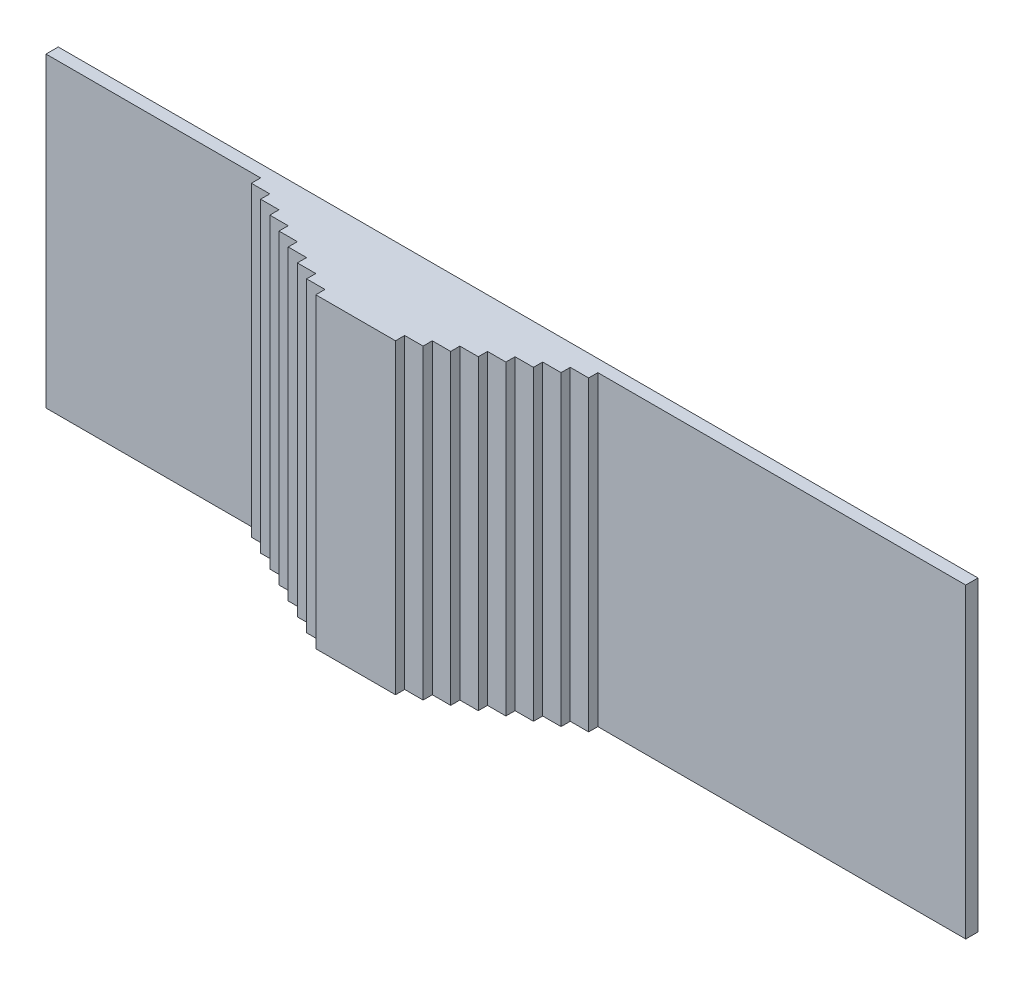
ISO-10303-21;
HEADER;
FILE_DESCRIPTION(('STEP AP214'),'2;1');
FILE_NAME('part.step','',(''),(''),'','','');
FILE_SCHEMA(('AUTOMOTIVE_DESIGN { 1 0 10303 214 1 1 1 1 }'));
ENDSEC;
DATA;
#1=APPLICATION_CONTEXT('core data for automotive mechanical design processes');
#2=APPLICATION_PROTOCOL_DEFINITION('international standard','automotive_design',2000,#1);
#3=PRODUCT_CONTEXT('',#1,'mechanical');
#4=PRODUCT('Part','Part','',(#3));
#5=PRODUCT_RELATED_PRODUCT_CATEGORY('part','',(#4));
#6=PRODUCT_DEFINITION_FORMATION('','',#4);
#7=PRODUCT_DEFINITION_CONTEXT('part definition',#1,'design');
#8=PRODUCT_DEFINITION('design','',#6,#7);
#9=PRODUCT_DEFINITION_SHAPE('','',#8);
#10=(LENGTH_UNIT() NAMED_UNIT(*) SI_UNIT(.MILLI.,.METRE.));
#11=(NAMED_UNIT(*) PLANE_ANGLE_UNIT() SI_UNIT($,.RADIAN.));
#12=(NAMED_UNIT(*) SI_UNIT($,.STERADIAN.) SOLID_ANGLE_UNIT());
#13=UNCERTAINTY_MEASURE_WITH_UNIT(LENGTH_MEASURE(1.E-05),#10,'distance_accuracy_value','');
#14=(GEOMETRIC_REPRESENTATION_CONTEXT(3) GLOBAL_UNCERTAINTY_ASSIGNED_CONTEXT((#13)) GLOBAL_UNIT_ASSIGNED_CONTEXT((#10,
#11,#12)) REPRESENTATION_CONTEXT('',''));
#15=CARTESIAN_POINT('',(0.,0.,0.));
#16=DIRECTION('',(0.,0.,1.));
#17=DIRECTION('',(1.,0.,0.));
#18=AXIS2_PLACEMENT_3D('',#15,#16,#17);
#19=CARTESIAN_POINT('',(0.,0.,200.));
#20=DIRECTION('',(0.,0.,1.));
#21=DIRECTION('',(1.,0.,0.));
#22=AXIS2_PLACEMENT_3D('',#19,#20,#21);
#23=PLANE('',#22);
#24=DIRECTION('',(-1.,0.,0.));
#25=VECTOR('',#24,1.);
#26=CARTESIAN_POINT('',(-2500.,2500.,200.));
#27=LINE('',#26,#25);
#28=CARTESIAN_POINT('',(12500.,2500.,200.));
#29=VERTEX_POINT('',#28);
#30=CARTESIAN_POINT('',(6500.,2500.,200.));
#31=VERTEX_POINT('',#30);
#32=EDGE_CURVE('E627',#29,#31,#27,.T.);
#33=ORIENTED_EDGE('',*,*,#32,.T.);
#34=DIRECTION('',(0.,1.,0.));
#35=VECTOR('',#34,1.);
#36=CARTESIAN_POINT('',(6500.,0.,200.));
#37=LINE('',#36,#35);
#38=CARTESIAN_POINT('',(6500.,-2500.,200.));
#39=VERTEX_POINT('',#38);
#40=EDGE_CURVE('E293',#39,#31,#37,.T.);
#41=ORIENTED_EDGE('',*,*,#40,.F.);
#42=DIRECTION('',(1.,0.,0.));
#43=VECTOR('',#42,1.);
#44=CARTESIAN_POINT('',(-2500.,-2500.,200.));
#45=LINE('',#44,#43);
#46=CARTESIAN_POINT('',(12500.,-2500.,200.));
#47=VERTEX_POINT('',#46);
#48=EDGE_CURVE('E298',#39,#47,#45,.T.);
#49=ORIENTED_EDGE('',*,*,#48,.T.);
#50=DIRECTION('',(0.,1.,0.));
#51=VECTOR('',#50,1.);
#52=CARTESIAN_POINT('',(12500.,2500.,200.));
#53=LINE('',#52,#51);
#54=EDGE_CURVE('E621',#47,#29,#53,.T.);
#55=ORIENTED_EDGE('',*,*,#54,.T.);
#56=EDGE_LOOP('',(#33,#41,#49,#55));
#57=FACE_BOUND('',#56,.T.);
#58=ADVANCED_FACE('F41',(#57),#23,.T.);
#59=CARTESIAN_POINT('',(-2500.,-2500.,200.));
#60=VERTEX_POINT('',#59);
#61=CARTESIAN_POINT('',(999.999999999999,-2500.,200.));
#62=VERTEX_POINT('',#61);
#63=EDGE_CURVE('E634',#60,#62,#45,.T.);
#64=ORIENTED_EDGE('',*,*,#63,.T.);
#65=DIRECTION('',(0.,1.,0.));
#66=VECTOR('',#65,1.);
#67=CARTESIAN_POINT('',(1000.,0.,200.));
#68=LINE('',#67,#66);
#69=CARTESIAN_POINT('',(1000.,2500.,200.));
#70=VERTEX_POINT('',#69);
#71=EDGE_CURVE('E594',#62,#70,#68,.T.);
#72=ORIENTED_EDGE('',*,*,#71,.T.);
#73=CARTESIAN_POINT('',(-2500.,2500.,200.));
#74=VERTEX_POINT('',#73);
#75=EDGE_CURVE('E625',#70,#74,#27,.T.);
#76=ORIENTED_EDGE('',*,*,#75,.T.);
#77=DIRECTION('',(0.,-1.,0.));
#78=VECTOR('',#77,1.);
#79=CARTESIAN_POINT('',(-2500.,2500.,200.));
#80=LINE('',#79,#78);
#81=EDGE_CURVE('E631',#74,#60,#80,.T.);
#82=ORIENTED_EDGE('',*,*,#81,.T.);
#83=EDGE_LOOP('',(#64,#72,#76,#82));
#84=FACE_BOUND('',#83,.T.);
#85=ADVANCED_FACE('F677',(#84),#23,.T.);
#86=CARTESIAN_POINT('',(12500.,2500.,200.));
#87=DIRECTION('',(-1.,0.,0.));
#88=DIRECTION('',(0.,-1.,0.));
#89=AXIS2_PLACEMENT_3D('',#86,#87,#88);
#90=PLANE('',#89);
#91=DIRECTION('',(0.,1.,0.));
#92=VECTOR('',#91,1.);
#93=CARTESIAN_POINT('',(12500.,2500.,0.));
#94=LINE('',#93,#92);
#95=CARTESIAN_POINT('',(12500.,-2500.,0.));
#96=VERTEX_POINT('',#95);
#97=CARTESIAN_POINT('',(12500.,2500.,0.));
#98=VERTEX_POINT('',#97);
#99=EDGE_CURVE('E620',#96,#98,#94,.T.);
#100=ORIENTED_EDGE('',*,*,#99,.T.);
#101=DIRECTION('',(0.,0.,-1.));
#102=VECTOR('',#101,1.);
#103=CARTESIAN_POINT('',(12500.,2500.,200.));
#104=LINE('',#103,#102);
#105=EDGE_CURVE('E11',#29,#98,#104,.T.);
#106=ORIENTED_EDGE('',*,*,#105,.F.);
#107=ORIENTED_EDGE('',*,*,#54,.F.);
#108=DIRECTION('',(0.,0.,-1.));
#109=VECTOR('',#108,1.);
#110=CARTESIAN_POINT('',(12500.,-2500.,200.));
#111=LINE('',#110,#109);
#112=EDGE_CURVE('E637',#47,#96,#111,.T.);
#113=ORIENTED_EDGE('',*,*,#112,.T.);
#114=EDGE_LOOP('',(#100,#106,#107,#113));
#115=FACE_BOUND('',#114,.T.);
#116=ADVANCED_FACE('F43',(#115),#90,.F.);
#117=CARTESIAN_POINT('',(-2500.,2500.,200.));
#118=DIRECTION('',(0.,-1.,0.));
#119=DIRECTION('',(1.,0.,0.));
#120=AXIS2_PLACEMENT_3D('',#117,#118,#119);
#121=PLANE('',#120);
#122=DIRECTION('',(-1.,0.,0.));
#123=VECTOR('',#122,1.);
#124=CARTESIAN_POINT('',(-2500.,2500.,0.));
#125=LINE('',#124,#123);
#126=CARTESIAN_POINT('',(-2500.,2500.,0.));
#127=VERTEX_POINT('',#126);
#128=EDGE_CURVE('E641',#98,#127,#125,.T.);
#129=ORIENTED_EDGE('',*,*,#128,.T.);
#130=DIRECTION('',(0.,0.,-1.));
#131=VECTOR('',#130,1.);
#132=CARTESIAN_POINT('',(-2500.,2500.,200.));
#133=LINE('',#132,#131);
#134=EDGE_CURVE('E50',#74,#127,#133,.T.);
#135=ORIENTED_EDGE('',*,*,#134,.F.);
#136=ORIENTED_EDGE('',*,*,#75,.F.);
#137=DIRECTION('',(0.,0.,-1.));
#138=VECTOR('',#137,1.);
#139=CARTESIAN_POINT('',(1000.,2500.,350.));
#140=LINE('',#139,#138);
#141=CARTESIAN_POINT('',(1000.,2500.,350.));
#142=VERTEX_POINT('',#141);
#143=EDGE_CURVE('E616',#142,#70,#140,.T.);
#144=ORIENTED_EDGE('',*,*,#143,.F.);
#145=DIRECTION('',(-1.,0.,0.));
#146=VECTOR('',#145,1.);
#147=CARTESIAN_POINT('',(-1.48029736616688E-13,2500.,350.));
#148=LINE('',#147,#146);
#149=CARTESIAN_POINT('',(1300.,2500.,350.));
#150=VERTEX_POINT('',#149);
#151=EDGE_CURVE('E603',#150,#142,#148,.T.);
#152=ORIENTED_EDGE('',*,*,#151,.F.);
#153=DIRECTION('',(0.,0.,-1.));
#154=VECTOR('',#153,1.);
#155=CARTESIAN_POINT('',(1300.,2500.,500.));
#156=LINE('',#155,#154);
#157=CARTESIAN_POINT('',(1300.,2500.,500.));
#158=VERTEX_POINT('',#157);
#159=EDGE_CURVE('E591',#158,#150,#156,.T.);
#160=ORIENTED_EDGE('',*,*,#159,.F.);
#161=DIRECTION('',(-1.,0.,0.));
#162=VECTOR('',#161,1.);
#163=CARTESIAN_POINT('',(-1.48029736616688E-13,2500.,500.));
#164=LINE('',#163,#162);
#165=CARTESIAN_POINT('',(1600.,2500.,500.));
#166=VERTEX_POINT('',#165);
#167=EDGE_CURVE('E580',#166,#158,#164,.T.);
#168=ORIENTED_EDGE('',*,*,#167,.F.);
#169=DIRECTION('',(0.,0.,-1.));
#170=VECTOR('',#169,1.);
#171=CARTESIAN_POINT('',(1600.,2500.,650.));
#172=LINE('',#171,#170);
#173=CARTESIAN_POINT('',(1600.,2500.,650.));
#174=VERTEX_POINT('',#173);
#175=EDGE_CURVE('E569',#174,#166,#172,.T.);
#176=ORIENTED_EDGE('',*,*,#175,.F.);
#177=DIRECTION('',(-1.,0.,0.));
#178=VECTOR('',#177,1.);
#179=CARTESIAN_POINT('',(-1.48029736616688E-13,2500.,650.));
#180=LINE('',#179,#178);
#181=CARTESIAN_POINT('',(1900.,2500.,650.));
#182=VERTEX_POINT('',#181);
#183=EDGE_CURVE('E558',#182,#174,#180,.T.);
#184=ORIENTED_EDGE('',*,*,#183,.F.);
#185=DIRECTION('',(0.,0.,-1.));
#186=VECTOR('',#185,1.);
#187=CARTESIAN_POINT('',(1900.,2500.,800.));
#188=LINE('',#187,#186);
#189=CARTESIAN_POINT('',(1900.,2500.,800.));
#190=VERTEX_POINT('',#189);
#191=EDGE_CURVE('E547',#190,#182,#188,.T.);
#192=ORIENTED_EDGE('',*,*,#191,.F.);
#193=DIRECTION('',(-1.,0.,0.));
#194=VECTOR('',#193,1.);
#195=CARTESIAN_POINT('',(-1.48029736616688E-13,2500.,800.));
#196=LINE('',#195,#194);
#197=CARTESIAN_POINT('',(2200.,2500.,800.));
#198=VERTEX_POINT('',#197);
#199=EDGE_CURVE('E536',#198,#190,#196,.T.);
#200=ORIENTED_EDGE('',*,*,#199,.F.);
#201=DIRECTION('',(0.,0.,-1.));
#202=VECTOR('',#201,1.);
#203=CARTESIAN_POINT('',(2200.,2500.,950.));
#204=LINE('',#203,#202);
#205=CARTESIAN_POINT('',(2200.,2500.,950.));
#206=VERTEX_POINT('',#205);
#207=EDGE_CURVE('E525',#206,#198,#204,.T.);
#208=ORIENTED_EDGE('',*,*,#207,.F.);
#209=DIRECTION('',(-1.,0.,0.));
#210=VECTOR('',#209,1.);
#211=CARTESIAN_POINT('',(-1.48029736616688E-13,2500.,950.));
#212=LINE('',#211,#210);
#213=CARTESIAN_POINT('',(2500.,2500.,950.));
#214=VERTEX_POINT('',#213);
#215=EDGE_CURVE('E514',#214,#206,#212,.T.);
#216=ORIENTED_EDGE('',*,*,#215,.F.);
#217=DIRECTION('',(0.,0.,-1.));
#218=VECTOR('',#217,1.);
#219=CARTESIAN_POINT('',(2500.,2500.,1100.));
#220=LINE('',#219,#218);
#221=CARTESIAN_POINT('',(2500.,2500.,1100.));
#222=VERTEX_POINT('',#221);
#223=EDGE_CURVE('E503',#222,#214,#220,.T.);
#224=ORIENTED_EDGE('',*,*,#223,.F.);
#225=DIRECTION('',(-1.,0.,0.));
#226=VECTOR('',#225,1.);
#227=CARTESIAN_POINT('',(-1.48029736616688E-13,2500.,1100.));
#228=LINE('',#227,#226);
#229=CARTESIAN_POINT('',(2800.,2500.,1100.));
#230=VERTEX_POINT('',#229);
#231=EDGE_CURVE('E492',#230,#222,#228,.T.);
#232=ORIENTED_EDGE('',*,*,#231,.F.);
#233=DIRECTION('',(0.,0.,-1.));
#234=VECTOR('',#233,1.);
#235=CARTESIAN_POINT('',(2800.,2500.,1250.));
#236=LINE('',#235,#234);
#237=CARTESIAN_POINT('',(2800.,2500.,1250.));
#238=VERTEX_POINT('',#237);
#239=EDGE_CURVE('E481',#238,#230,#236,.T.);
#240=ORIENTED_EDGE('',*,*,#239,.F.);
#241=DIRECTION('',(-1.,0.,0.));
#242=VECTOR('',#241,1.);
#243=CARTESIAN_POINT('',(-1.48029736616688E-13,2500.,1250.));
#244=LINE('',#243,#242);
#245=CARTESIAN_POINT('',(3100.,2500.,1250.));
#246=VERTEX_POINT('',#245);
#247=EDGE_CURVE('E470',#246,#238,#244,.T.);
#248=ORIENTED_EDGE('',*,*,#247,.F.);
#249=DIRECTION('',(0.,0.,-1.));
#250=VECTOR('',#249,1.);
#251=CARTESIAN_POINT('',(3100.,2500.,1400.));
#252=LINE('',#251,#250);
#253=CARTESIAN_POINT('',(3100.,2500.,1400.));
#254=VERTEX_POINT('',#253);
#255=EDGE_CURVE('E459',#254,#246,#252,.T.);
#256=ORIENTED_EDGE('',*,*,#255,.F.);
#257=DIRECTION('',(-1.,0.,0.));
#258=VECTOR('',#257,1.);
#259=CARTESIAN_POINT('',(-1.48029736616688E-13,2500.,1400.));
#260=LINE('',#259,#258);
#261=CARTESIAN_POINT('',(4400.,2500.,1400.));
#262=VERTEX_POINT('',#261);
#263=EDGE_CURVE('E448',#262,#254,#260,.T.);
#264=ORIENTED_EDGE('',*,*,#263,.F.);
#265=DIRECTION('',(0.,0.,-1.));
#266=VECTOR('',#265,1.);
#267=CARTESIAN_POINT('',(4400.,2500.,1400.));
#268=LINE('',#267,#266);
#269=CARTESIAN_POINT('',(4400.,2500.,1250.));
#270=VERTEX_POINT('',#269);
#271=EDGE_CURVE('E437',#262,#270,#268,.T.);
#272=ORIENTED_EDGE('',*,*,#271,.T.);
#273=DIRECTION('',(-1.,0.,0.));
#274=VECTOR('',#273,1.);
#275=CARTESIAN_POINT('',(-1.48029736616688E-13,2500.,1250.));
#276=LINE('',#275,#274);
#277=CARTESIAN_POINT('',(4700.,2500.,1250.));
#278=VERTEX_POINT('',#277);
#279=EDGE_CURVE('E419',#278,#270,#276,.T.);
#280=ORIENTED_EDGE('',*,*,#279,.F.);
#281=DIRECTION('',(0.,0.,-1.));
#282=VECTOR('',#281,1.);
#283=CARTESIAN_POINT('',(4700.,2500.,1250.));
#284=LINE('',#283,#282);
#285=CARTESIAN_POINT('',(4700.,2500.,1100.));
#286=VERTEX_POINT('',#285);
#287=EDGE_CURVE('E425',#278,#286,#284,.T.);
#288=ORIENTED_EDGE('',*,*,#287,.T.);
#289=DIRECTION('',(-1.,0.,0.));
#290=VECTOR('',#289,1.);
#291=CARTESIAN_POINT('',(-1.48029736616688E-13,2500.,1100.));
#292=LINE('',#291,#290);
#293=CARTESIAN_POINT('',(5000.,2500.,1100.));
#294=VERTEX_POINT('',#293);
#295=EDGE_CURVE('E397',#294,#286,#292,.T.);
#296=ORIENTED_EDGE('',*,*,#295,.F.);
#297=DIRECTION('',(0.,0.,-1.));
#298=VECTOR('',#297,1.);
#299=CARTESIAN_POINT('',(5000.,2500.,1100.));
#300=LINE('',#299,#298);
#301=CARTESIAN_POINT('',(5000.,2500.,950.));
#302=VERTEX_POINT('',#301);
#303=EDGE_CURVE('E404',#294,#302,#300,.T.);
#304=ORIENTED_EDGE('',*,*,#303,.T.);
#305=DIRECTION('',(-1.,0.,0.));
#306=VECTOR('',#305,1.);
#307=CARTESIAN_POINT('',(-1.48029736616688E-13,2500.,950.));
#308=LINE('',#307,#306);
#309=CARTESIAN_POINT('',(5300.,2500.,950.));
#310=VERTEX_POINT('',#309);
#311=EDGE_CURVE('E375',#310,#302,#308,.T.);
#312=ORIENTED_EDGE('',*,*,#311,.F.);
#313=DIRECTION('',(0.,0.,-1.));
#314=VECTOR('',#313,1.);
#315=CARTESIAN_POINT('',(5300.,2500.,950.));
#316=LINE('',#315,#314);
#317=CARTESIAN_POINT('',(5300.,2500.,800.));
#318=VERTEX_POINT('',#317);
#319=EDGE_CURVE('E382',#310,#318,#316,.T.);
#320=ORIENTED_EDGE('',*,*,#319,.T.);
#321=DIRECTION('',(-1.,0.,0.));
#322=VECTOR('',#321,1.);
#323=CARTESIAN_POINT('',(-1.48029736616688E-13,2500.,800.));
#324=LINE('',#323,#322);
#325=CARTESIAN_POINT('',(5600.,2500.,800.));
#326=VERTEX_POINT('',#325);
#327=EDGE_CURVE('E353',#326,#318,#324,.T.);
#328=ORIENTED_EDGE('',*,*,#327,.F.);
#329=DIRECTION('',(0.,0.,-1.));
#330=VECTOR('',#329,1.);
#331=CARTESIAN_POINT('',(5600.,2500.,800.));
#332=LINE('',#331,#330);
#333=CARTESIAN_POINT('',(5600.,2500.,650.));
#334=VERTEX_POINT('',#333);
#335=EDGE_CURVE('E360',#326,#334,#332,.T.);
#336=ORIENTED_EDGE('',*,*,#335,.T.);
#337=DIRECTION('',(-1.,0.,0.));
#338=VECTOR('',#337,1.);
#339=CARTESIAN_POINT('',(-1.48029736616688E-13,2500.,650.));
#340=LINE('',#339,#338);
#341=CARTESIAN_POINT('',(5900.,2500.,650.));
#342=VERTEX_POINT('',#341);
#343=EDGE_CURVE('E331',#342,#334,#340,.T.);
#344=ORIENTED_EDGE('',*,*,#343,.F.);
#345=DIRECTION('',(0.,0.,-1.));
#346=VECTOR('',#345,1.);
#347=CARTESIAN_POINT('',(5900.,2500.,650.));
#348=LINE('',#347,#346);
#349=CARTESIAN_POINT('',(5900.,2500.,500.));
#350=VERTEX_POINT('',#349);
#351=EDGE_CURVE('E338',#342,#350,#348,.T.);
#352=ORIENTED_EDGE('',*,*,#351,.T.);
#353=DIRECTION('',(-1.,0.,0.));
#354=VECTOR('',#353,1.);
#355=CARTESIAN_POINT('',(-1.48029736616688E-13,2500.,500.));
#356=LINE('',#355,#354);
#357=CARTESIAN_POINT('',(6200.,2500.,500.));
#358=VERTEX_POINT('',#357);
#359=EDGE_CURVE('E65',#358,#350,#356,.T.);
#360=ORIENTED_EDGE('',*,*,#359,.F.);
#361=DIRECTION('',(0.,0.,-1.));
#362=VECTOR('',#361,1.);
#363=CARTESIAN_POINT('',(6200.,2500.,500.));
#364=LINE('',#363,#362);
#365=CARTESIAN_POINT('',(6200.,2500.,350.));
#366=VERTEX_POINT('',#365);
#367=EDGE_CURVE('E317',#358,#366,#364,.T.);
#368=ORIENTED_EDGE('',*,*,#367,.T.);
#369=DIRECTION('',(-1.,0.,0.));
#370=VECTOR('',#369,1.);
#371=CARTESIAN_POINT('',(-1.48029736616688E-13,2500.,350.));
#372=LINE('',#371,#370);
#373=CARTESIAN_POINT('',(6500.,2500.,350.));
#374=VERTEX_POINT('',#373);
#375=EDGE_CURVE('E57',#374,#366,#372,.T.);
#376=ORIENTED_EDGE('',*,*,#375,.F.);
#377=DIRECTION('',(0.,0.,-1.));
#378=VECTOR('',#377,1.);
#379=CARTESIAN_POINT('',(6500.,2500.,350.));
#380=LINE('',#379,#378);
#381=EDGE_CURVE('E283',#374,#31,#380,.T.);
#382=ORIENTED_EDGE('',*,*,#381,.T.);
#383=ORIENTED_EDGE('',*,*,#32,.F.);
#384=ORIENTED_EDGE('',*,*,#105,.T.);
#385=EDGE_LOOP('',(#129,#135,#136,#144,#152,#160,#168,#176,#184,#192,#200,#208,#216,#224,#232,
#240,#248,#256,#264,#272,#280,#288,#296,#304,#312,#320,#328,#336,#344,#352,#360,#368,#376,#382,
#383,#384));
#386=FACE_BOUND('',#385,.T.);
#387=ADVANCED_FACE('F680',(#386),#121,.F.);
#388=CARTESIAN_POINT('',(-2500.,2500.,200.));
#389=DIRECTION('',(1.,0.,0.));
#390=DIRECTION('',(0.,1.,0.));
#391=AXIS2_PLACEMENT_3D('',#388,#389,#390);
#392=PLANE('',#391);
#393=DIRECTION('',(0.,-1.,0.));
#394=VECTOR('',#393,1.);
#395=CARTESIAN_POINT('',(-2500.,2500.,0.));
#396=LINE('',#395,#394);
#397=CARTESIAN_POINT('',(-2500.,-2500.,0.));
#398=VERTEX_POINT('',#397);
#399=EDGE_CURVE('E644',#127,#398,#396,.T.);
#400=ORIENTED_EDGE('',*,*,#399,.T.);
#401=DIRECTION('',(0.,0.,-1.));
#402=VECTOR('',#401,1.);
#403=CARTESIAN_POINT('',(-2500.,-2500.,200.));
#404=LINE('',#403,#402);
#405=EDGE_CURVE('E652',#60,#398,#404,.T.);
#406=ORIENTED_EDGE('',*,*,#405,.F.);
#407=ORIENTED_EDGE('',*,*,#81,.F.);
#408=ORIENTED_EDGE('',*,*,#134,.T.);
#409=EDGE_LOOP('',(#400,#406,#407,#408));
#410=FACE_BOUND('',#409,.T.);
#411=ADVANCED_FACE('F661',(#410),#392,.F.);
#412=CARTESIAN_POINT('',(-2500.,-2500.,200.));
#413=DIRECTION('',(0.,1.,0.));
#414=DIRECTION('',(-1.,0.,0.));
#415=AXIS2_PLACEMENT_3D('',#412,#413,#414);
#416=PLANE('',#415);
#417=ORIENTED_EDGE('',*,*,#48,.F.);
#418=DIRECTION('',(0.,0.,-1.));
#419=VECTOR('',#418,1.);
#420=CARTESIAN_POINT('',(6500.,-2500.,350.));
#421=LINE('',#420,#419);
#422=CARTESIAN_POINT('',(6500.,-2500.,350.));
#423=VERTEX_POINT('',#422);
#424=EDGE_CURVE('E280',#423,#39,#421,.T.);
#425=ORIENTED_EDGE('',*,*,#424,.F.);
#426=DIRECTION('',(1.,0.,0.));
#427=VECTOR('',#426,1.);
#428=CARTESIAN_POINT('',(1.48029736616687E-13,-2500.,350.));
#429=LINE('',#428,#427);
#430=CARTESIAN_POINT('',(6200.,-2500.,350.));
#431=VERTEX_POINT('',#430);
#432=EDGE_CURVE('E285',#431,#423,#429,.T.);
#433=ORIENTED_EDGE('',*,*,#432,.F.);
#434=DIRECTION('',(0.,0.,-1.));
#435=VECTOR('',#434,1.);
#436=CARTESIAN_POINT('',(6200.,-2500.,500.));
#437=LINE('',#436,#435);
#438=CARTESIAN_POINT('',(6200.,-2500.,500.));
#439=VERTEX_POINT('',#438);
#440=EDGE_CURVE('E321',#439,#431,#437,.T.);
#441=ORIENTED_EDGE('',*,*,#440,.F.);
#442=DIRECTION('',(1.,0.,0.));
#443=VECTOR('',#442,1.);
#444=CARTESIAN_POINT('',(1.48029736616687E-13,-2500.,500.));
#445=LINE('',#444,#443);
#446=CARTESIAN_POINT('',(5900.,-2500.,500.));
#447=VERTEX_POINT('',#446);
#448=EDGE_CURVE('E300',#447,#439,#445,.T.);
#449=ORIENTED_EDGE('',*,*,#448,.F.);
#450=DIRECTION('',(0.,0.,-1.));
#451=VECTOR('',#450,1.);
#452=CARTESIAN_POINT('',(5900.,-2500.,650.));
#453=LINE('',#452,#451);
#454=CARTESIAN_POINT('',(5900.,-2500.,650.));
#455=VERTEX_POINT('',#454);
#456=EDGE_CURVE('E342',#455,#447,#453,.T.);
#457=ORIENTED_EDGE('',*,*,#456,.F.);
#458=DIRECTION('',(1.,0.,0.));
#459=VECTOR('',#458,1.);
#460=CARTESIAN_POINT('',(1.48029736616687E-13,-2500.,650.));
#461=LINE('',#460,#459);
#462=CARTESIAN_POINT('',(5600.,-2500.,650.));
#463=VERTEX_POINT('',#462);
#464=EDGE_CURVE('E324',#463,#455,#461,.T.);
#465=ORIENTED_EDGE('',*,*,#464,.F.);
#466=DIRECTION('',(0.,0.,-1.));
#467=VECTOR('',#466,1.);
#468=CARTESIAN_POINT('',(5600.,-2500.,800.));
#469=LINE('',#468,#467);
#470=CARTESIAN_POINT('',(5600.,-2500.,800.));
#471=VERTEX_POINT('',#470);
#472=EDGE_CURVE('E364',#471,#463,#469,.T.);
#473=ORIENTED_EDGE('',*,*,#472,.F.);
#474=DIRECTION('',(1.,0.,0.));
#475=VECTOR('',#474,1.);
#476=CARTESIAN_POINT('',(1.48029736616687E-13,-2500.,800.));
#477=LINE('',#476,#475);
#478=CARTESIAN_POINT('',(5300.,-2500.,800.));
#479=VERTEX_POINT('',#478);
#480=EDGE_CURVE('E346',#479,#471,#477,.T.);
#481=ORIENTED_EDGE('',*,*,#480,.F.);
#482=DIRECTION('',(0.,0.,-1.));
#483=VECTOR('',#482,1.);
#484=CARTESIAN_POINT('',(5300.,-2500.,950.));
#485=LINE('',#484,#483);
#486=CARTESIAN_POINT('',(5300.,-2500.,950.));
#487=VERTEX_POINT('',#486);
#488=EDGE_CURVE('E386',#487,#479,#485,.T.);
#489=ORIENTED_EDGE('',*,*,#488,.F.);
#490=DIRECTION('',(1.,0.,0.));
#491=VECTOR('',#490,1.);
#492=CARTESIAN_POINT('',(1.48029736616687E-13,-2500.,950.));
#493=LINE('',#492,#491);
#494=CARTESIAN_POINT('',(5000.,-2500.,950.));
#495=VERTEX_POINT('',#494);
#496=EDGE_CURVE('E368',#495,#487,#493,.T.);
#497=ORIENTED_EDGE('',*,*,#496,.F.);
#498=DIRECTION('',(0.,0.,-1.));
#499=VECTOR('',#498,1.);
#500=CARTESIAN_POINT('',(5000.,-2500.,1100.));
#501=LINE('',#500,#499);
#502=CARTESIAN_POINT('',(5000.,-2500.,1100.));
#503=VERTEX_POINT('',#502);
#504=EDGE_CURVE('E408',#503,#495,#501,.T.);
#505=ORIENTED_EDGE('',*,*,#504,.F.);
#506=DIRECTION('',(1.,0.,0.));
#507=VECTOR('',#506,1.);
#508=CARTESIAN_POINT('',(1.48029736616687E-13,-2500.,1100.));
#509=LINE('',#508,#507);
#510=CARTESIAN_POINT('',(4700.,-2500.,1100.));
#511=VERTEX_POINT('',#510);
#512=EDGE_CURVE('E390',#511,#503,#509,.T.);
#513=ORIENTED_EDGE('',*,*,#512,.F.);
#514=DIRECTION('',(0.,0.,-1.));
#515=VECTOR('',#514,1.);
#516=CARTESIAN_POINT('',(4700.,-2500.,1250.));
#517=LINE('',#516,#515);
#518=CARTESIAN_POINT('',(4700.,-2500.,1250.));
#519=VERTEX_POINT('',#518);
#520=EDGE_CURVE('E429',#519,#511,#517,.T.);
#521=ORIENTED_EDGE('',*,*,#520,.F.);
#522=DIRECTION('',(1.,0.,0.));
#523=VECTOR('',#522,1.);
#524=CARTESIAN_POINT('',(1.48029736616687E-13,-2500.,1250.));
#525=LINE('',#524,#523);
#526=CARTESIAN_POINT('',(4400.,-2500.,1250.));
#527=VERTEX_POINT('',#526);
#528=EDGE_CURVE('E412',#527,#519,#525,.T.);
#529=ORIENTED_EDGE('',*,*,#528,.F.);
#530=DIRECTION('',(0.,0.,-1.));
#531=VECTOR('',#530,1.);
#532=CARTESIAN_POINT('',(4400.,-2500.,1400.));
#533=LINE('',#532,#531);
#534=CARTESIAN_POINT('',(4400.,-2500.,1400.));
#535=VERTEX_POINT('',#534);
#536=EDGE_CURVE('E441',#535,#527,#533,.T.);
#537=ORIENTED_EDGE('',*,*,#536,.F.);
#538=DIRECTION('',(1.,0.,0.));
#539=VECTOR('',#538,1.);
#540=CARTESIAN_POINT('',(1.48029736616687E-13,-2500.,1400.));
#541=LINE('',#540,#539);
#542=CARTESIAN_POINT('',(3100.,-2500.,1400.));
#543=VERTEX_POINT('',#542);
#544=EDGE_CURVE('E445',#543,#535,#541,.T.);
#545=ORIENTED_EDGE('',*,*,#544,.F.);
#546=DIRECTION('',(0.,0.,-1.));
#547=VECTOR('',#546,1.);
#548=CARTESIAN_POINT('',(3100.,-2500.,1400.));
#549=LINE('',#548,#547);
#550=CARTESIAN_POINT('',(3100.,-2500.,1250.));
#551=VERTEX_POINT('',#550);
#552=EDGE_CURVE('E455',#543,#551,#549,.T.);
#553=ORIENTED_EDGE('',*,*,#552,.T.);
#554=DIRECTION('',(1.,0.,0.));
#555=VECTOR('',#554,1.);
#556=CARTESIAN_POINT('',(1.48029736616687E-13,-2500.,1250.));
#557=LINE('',#556,#555);
#558=CARTESIAN_POINT('',(2800.,-2500.,1250.));
#559=VERTEX_POINT('',#558);
#560=EDGE_CURVE('E462',#559,#551,#557,.T.);
#561=ORIENTED_EDGE('',*,*,#560,.F.);
#562=DIRECTION('',(0.,0.,-1.));
#563=VECTOR('',#562,1.);
#564=CARTESIAN_POINT('',(2800.,-2500.,1250.));
#565=LINE('',#564,#563);
#566=CARTESIAN_POINT('',(2800.,-2500.,1100.));
#567=VERTEX_POINT('',#566);
#568=EDGE_CURVE('E477',#559,#567,#565,.T.);
#569=ORIENTED_EDGE('',*,*,#568,.T.);
#570=DIRECTION('',(1.,0.,0.));
#571=VECTOR('',#570,1.);
#572=CARTESIAN_POINT('',(1.48029736616687E-13,-2500.,1100.));
#573=LINE('',#572,#571);
#574=CARTESIAN_POINT('',(2500.,-2500.,1100.));
#575=VERTEX_POINT('',#574);
#576=EDGE_CURVE('E484',#575,#567,#573,.T.);
#577=ORIENTED_EDGE('',*,*,#576,.F.);
#578=DIRECTION('',(0.,0.,-1.));
#579=VECTOR('',#578,1.);
#580=CARTESIAN_POINT('',(2500.,-2500.,1100.));
#581=LINE('',#580,#579);
#582=CARTESIAN_POINT('',(2500.,-2500.,950.));
#583=VERTEX_POINT('',#582);
#584=EDGE_CURVE('E499',#575,#583,#581,.T.);
#585=ORIENTED_EDGE('',*,*,#584,.T.);
#586=DIRECTION('',(1.,0.,0.));
#587=VECTOR('',#586,1.);
#588=CARTESIAN_POINT('',(1.48029736616687E-13,-2500.,950.));
#589=LINE('',#588,#587);
#590=CARTESIAN_POINT('',(2200.,-2500.,950.));
#591=VERTEX_POINT('',#590);
#592=EDGE_CURVE('E506',#591,#583,#589,.T.);
#593=ORIENTED_EDGE('',*,*,#592,.F.);
#594=DIRECTION('',(0.,0.,-1.));
#595=VECTOR('',#594,1.);
#596=CARTESIAN_POINT('',(2200.,-2500.,950.));
#597=LINE('',#596,#595);
#598=CARTESIAN_POINT('',(2200.,-2500.,800.));
#599=VERTEX_POINT('',#598);
#600=EDGE_CURVE('E521',#591,#599,#597,.T.);
#601=ORIENTED_EDGE('',*,*,#600,.T.);
#602=DIRECTION('',(1.,0.,0.));
#603=VECTOR('',#602,1.);
#604=CARTESIAN_POINT('',(1.48029736616687E-13,-2500.,800.));
#605=LINE('',#604,#603);
#606=CARTESIAN_POINT('',(1900.,-2500.,800.));
#607=VERTEX_POINT('',#606);
#608=EDGE_CURVE('E528',#607,#599,#605,.T.);
#609=ORIENTED_EDGE('',*,*,#608,.F.);
#610=DIRECTION('',(0.,0.,-1.));
#611=VECTOR('',#610,1.);
#612=CARTESIAN_POINT('',(1900.,-2500.,800.));
#613=LINE('',#612,#611);
#614=CARTESIAN_POINT('',(1900.,-2500.,650.));
#615=VERTEX_POINT('',#614);
#616=EDGE_CURVE('E543',#607,#615,#613,.T.);
#617=ORIENTED_EDGE('',*,*,#616,.T.);
#618=DIRECTION('',(1.,0.,0.));
#619=VECTOR('',#618,1.);
#620=CARTESIAN_POINT('',(1.48029736616687E-13,-2500.,650.));
#621=LINE('',#620,#619);
#622=CARTESIAN_POINT('',(1600.,-2500.,650.));
#623=VERTEX_POINT('',#622);
#624=EDGE_CURVE('E550',#623,#615,#621,.T.);
#625=ORIENTED_EDGE('',*,*,#624,.F.);
#626=DIRECTION('',(0.,0.,-1.));
#627=VECTOR('',#626,1.);
#628=CARTESIAN_POINT('',(1600.,-2500.,650.));
#629=LINE('',#628,#627);
#630=CARTESIAN_POINT('',(1600.,-2500.,500.));
#631=VERTEX_POINT('',#630);
#632=EDGE_CURVE('E565',#623,#631,#629,.T.);
#633=ORIENTED_EDGE('',*,*,#632,.T.);
#634=DIRECTION('',(1.,0.,0.));
#635=VECTOR('',#634,1.);
#636=CARTESIAN_POINT('',(1.48029736616687E-13,-2500.,500.));
#637=LINE('',#636,#635);
#638=CARTESIAN_POINT('',(1300.,-2500.,500.));
#639=VERTEX_POINT('',#638);
#640=EDGE_CURVE('E572',#639,#631,#637,.T.);
#641=ORIENTED_EDGE('',*,*,#640,.F.);
#642=DIRECTION('',(0.,0.,-1.));
#643=VECTOR('',#642,1.);
#644=CARTESIAN_POINT('',(1300.,-2500.,500.));
#645=LINE('',#644,#643);
#646=CARTESIAN_POINT('',(1300.,-2500.,350.));
#647=VERTEX_POINT('',#646);
#648=EDGE_CURVE('E587',#639,#647,#645,.T.);
#649=ORIENTED_EDGE('',*,*,#648,.T.);
#650=DIRECTION('',(1.,0.,0.));
#651=VECTOR('',#650,1.);
#652=CARTESIAN_POINT('',(1.48029736616687E-13,-2500.,350.));
#653=LINE('',#652,#651);
#654=CARTESIAN_POINT('',(1000.,-2500.,350.));
#655=VERTEX_POINT('',#654);
#656=EDGE_CURVE('E595',#655,#647,#653,.T.);
#657=ORIENTED_EDGE('',*,*,#656,.F.);
#658=DIRECTION('',(0.,0.,-1.));
#659=VECTOR('',#658,1.);
#660=CARTESIAN_POINT('',(1000.,-2500.,350.));
#661=LINE('',#660,#659);
#662=EDGE_CURVE('E610',#655,#62,#661,.T.);
#663=ORIENTED_EDGE('',*,*,#662,.T.);
#664=ORIENTED_EDGE('',*,*,#63,.F.);
#665=ORIENTED_EDGE('',*,*,#405,.T.);
#666=DIRECTION('',(1.,0.,0.));
#667=VECTOR('',#666,1.);
#668=CARTESIAN_POINT('',(-2500.,-2500.,0.));
#669=LINE('',#668,#667);
#670=EDGE_CURVE('E626',#398,#96,#669,.T.);
#671=ORIENTED_EDGE('',*,*,#670,.T.);
#672=ORIENTED_EDGE('',*,*,#112,.F.);
#673=EDGE_LOOP('',(#417,#425,#433,#441,#449,#457,#465,#473,#481,#489,#497,#505,#513,#521,#529,
#537,#545,#553,#561,#569,#577,#585,#593,#601,#609,#617,#625,#633,#641,#649,#657,#663,#664,#665,
#671,#672));
#674=FACE_BOUND('',#673,.T.);
#675=ADVANCED_FACE('F296',(#674),#416,.F.);
#676=CARTESIAN_POINT('',(0.,0.,0.));
#677=DIRECTION('',(0.,0.,1.));
#678=DIRECTION('',(1.,0.,0.));
#679=AXIS2_PLACEMENT_3D('',#676,#677,#678);
#680=PLANE('',#679);
#681=ORIENTED_EDGE('',*,*,#99,.F.);
#682=ORIENTED_EDGE('',*,*,#670,.F.);
#683=ORIENTED_EDGE('',*,*,#399,.F.);
#684=ORIENTED_EDGE('',*,*,#128,.F.);
#685=EDGE_LOOP('',(#681,#682,#683,#684));
#686=FACE_BOUND('',#685,.T.);
#687=ADVANCED_FACE('F668',(#686),#680,.F.);
#688=CARTESIAN_POINT('',(1000.,0.,350.));
#689=DIRECTION('',(-1.,0.,0.));
#690=DIRECTION('',(0.,0.,1.));
#691=AXIS2_PLACEMENT_3D('',#688,#689,#690);
#692=PLANE('',#691);
#693=ORIENTED_EDGE('',*,*,#71,.F.);
#694=ORIENTED_EDGE('',*,*,#662,.F.);
#695=DIRECTION('',(0.,1.,0.));
#696=VECTOR('',#695,1.);
#697=CARTESIAN_POINT('',(1000.,0.,350.));
#698=LINE('',#697,#696);
#699=EDGE_CURVE('E606',#655,#142,#698,.T.);
#700=ORIENTED_EDGE('',*,*,#699,.T.);
#701=ORIENTED_EDGE('',*,*,#143,.T.);
#702=EDGE_LOOP('',(#693,#694,#700,#701));
#703=FACE_BOUND('',#702,.T.);
#704=ADVANCED_FACE('F683',(#703),#692,.T.);
#705=CARTESIAN_POINT('',(0.,0.,350.));
#706=DIRECTION('',(0.,0.,1.));
#707=DIRECTION('',(1.,0.,0.));
#708=AXIS2_PLACEMENT_3D('',#705,#706,#707);
#709=PLANE('',#708);
#710=ORIENTED_EDGE('',*,*,#656,.T.);
#711=DIRECTION('',(0.,1.,0.));
#712=VECTOR('',#711,1.);
#713=CARTESIAN_POINT('',(1300.,0.,350.));
#714=LINE('',#713,#712);
#715=EDGE_CURVE('E599',#647,#150,#714,.T.);
#716=ORIENTED_EDGE('',*,*,#715,.T.);
#717=ORIENTED_EDGE('',*,*,#151,.T.);
#718=ORIENTED_EDGE('',*,*,#699,.F.);
#719=EDGE_LOOP('',(#710,#716,#717,#718));
#720=FACE_BOUND('',#719,.T.);
#721=ADVANCED_FACE('F687',(#720),#709,.T.);
#722=CARTESIAN_POINT('',(1300.,0.,500.));
#723=DIRECTION('',(-1.,0.,0.));
#724=DIRECTION('',(0.,0.,1.));
#725=AXIS2_PLACEMENT_3D('',#722,#723,#724);
#726=PLANE('',#725);
#727=ORIENTED_EDGE('',*,*,#159,.T.);
#728=ORIENTED_EDGE('',*,*,#715,.F.);
#729=ORIENTED_EDGE('',*,*,#648,.F.);
#730=DIRECTION('',(0.,1.,0.));
#731=VECTOR('',#730,1.);
#732=CARTESIAN_POINT('',(1300.,0.,500.));
#733=LINE('',#732,#731);
#734=EDGE_CURVE('E583',#639,#158,#733,.T.);
#735=ORIENTED_EDGE('',*,*,#734,.T.);
#736=EDGE_LOOP('',(#727,#728,#729,#735));
#737=FACE_BOUND('',#736,.T.);
#738=ADVANCED_FACE('F693',(#737),#726,.T.);
#739=CARTESIAN_POINT('',(0.,0.,500.));
#740=DIRECTION('',(0.,0.,1.));
#741=DIRECTION('',(1.,0.,0.));
#742=AXIS2_PLACEMENT_3D('',#739,#740,#741);
#743=PLANE('',#742);
#744=ORIENTED_EDGE('',*,*,#640,.T.);
#745=DIRECTION('',(0.,1.,0.));
#746=VECTOR('',#745,1.);
#747=CARTESIAN_POINT('',(1600.,0.,500.));
#748=LINE('',#747,#746);
#749=EDGE_CURVE('E576',#631,#166,#748,.T.);
#750=ORIENTED_EDGE('',*,*,#749,.T.);
#751=ORIENTED_EDGE('',*,*,#167,.T.);
#752=ORIENTED_EDGE('',*,*,#734,.F.);
#753=EDGE_LOOP('',(#744,#750,#751,#752));
#754=FACE_BOUND('',#753,.T.);
#755=ADVANCED_FACE('F696',(#754),#743,.T.);
#756=CARTESIAN_POINT('',(1600.,0.,650.));
#757=DIRECTION('',(-1.,0.,0.));
#758=DIRECTION('',(0.,0.,1.));
#759=AXIS2_PLACEMENT_3D('',#756,#757,#758);
#760=PLANE('',#759);
#761=ORIENTED_EDGE('',*,*,#175,.T.);
#762=ORIENTED_EDGE('',*,*,#749,.F.);
#763=ORIENTED_EDGE('',*,*,#632,.F.);
#764=DIRECTION('',(0.,1.,0.));
#765=VECTOR('',#764,1.);
#766=CARTESIAN_POINT('',(1600.,0.,650.));
#767=LINE('',#766,#765);
#768=EDGE_CURVE('E561',#623,#174,#767,.T.);
#769=ORIENTED_EDGE('',*,*,#768,.T.);
#770=EDGE_LOOP('',(#761,#762,#763,#769));
#771=FACE_BOUND('',#770,.T.);
#772=ADVANCED_FACE('F698',(#771),#760,.T.);
#773=CARTESIAN_POINT('',(0.,0.,650.));
#774=DIRECTION('',(0.,0.,1.));
#775=DIRECTION('',(1.,0.,0.));
#776=AXIS2_PLACEMENT_3D('',#773,#774,#775);
#777=PLANE('',#776);
#778=ORIENTED_EDGE('',*,*,#624,.T.);
#779=DIRECTION('',(0.,1.,0.));
#780=VECTOR('',#779,1.);
#781=CARTESIAN_POINT('',(1900.,0.,650.));
#782=LINE('',#781,#780);
#783=EDGE_CURVE('E554',#615,#182,#782,.T.);
#784=ORIENTED_EDGE('',*,*,#783,.T.);
#785=ORIENTED_EDGE('',*,*,#183,.T.);
#786=ORIENTED_EDGE('',*,*,#768,.F.);
#787=EDGE_LOOP('',(#778,#784,#785,#786));
#788=FACE_BOUND('',#787,.T.);
#789=ADVANCED_FACE('F703',(#788),#777,.T.);
#790=CARTESIAN_POINT('',(1900.,0.,800.));
#791=DIRECTION('',(-1.,0.,0.));
#792=DIRECTION('',(0.,0.,1.));
#793=AXIS2_PLACEMENT_3D('',#790,#791,#792);
#794=PLANE('',#793);
#795=ORIENTED_EDGE('',*,*,#191,.T.);
#796=ORIENTED_EDGE('',*,*,#783,.F.);
#797=ORIENTED_EDGE('',*,*,#616,.F.);
#798=DIRECTION('',(0.,1.,0.));
#799=VECTOR('',#798,1.);
#800=CARTESIAN_POINT('',(1900.,0.,800.));
#801=LINE('',#800,#799);
#802=EDGE_CURVE('E539',#607,#190,#801,.T.);
#803=ORIENTED_EDGE('',*,*,#802,.T.);
#804=EDGE_LOOP('',(#795,#796,#797,#803));
#805=FACE_BOUND('',#804,.T.);
#806=ADVANCED_FACE('F710',(#805),#794,.T.);
#807=CARTESIAN_POINT('',(0.,0.,800.));
#808=DIRECTION('',(0.,0.,1.));
#809=DIRECTION('',(1.,0.,0.));
#810=AXIS2_PLACEMENT_3D('',#807,#808,#809);
#811=PLANE('',#810);
#812=ORIENTED_EDGE('',*,*,#608,.T.);
#813=DIRECTION('',(0.,1.,0.));
#814=VECTOR('',#813,1.);
#815=CARTESIAN_POINT('',(2200.,0.,800.));
#816=LINE('',#815,#814);
#817=EDGE_CURVE('E532',#599,#198,#816,.T.);
#818=ORIENTED_EDGE('',*,*,#817,.T.);
#819=ORIENTED_EDGE('',*,*,#199,.T.);
#820=ORIENTED_EDGE('',*,*,#802,.F.);
#821=EDGE_LOOP('',(#812,#818,#819,#820));
#822=FACE_BOUND('',#821,.T.);
#823=ADVANCED_FACE('F712',(#822),#811,.T.);
#824=CARTESIAN_POINT('',(2200.,0.,950.));
#825=DIRECTION('',(-1.,0.,0.));
#826=DIRECTION('',(0.,0.,1.));
#827=AXIS2_PLACEMENT_3D('',#824,#825,#826);
#828=PLANE('',#827);
#829=ORIENTED_EDGE('',*,*,#207,.T.);
#830=ORIENTED_EDGE('',*,*,#817,.F.);
#831=ORIENTED_EDGE('',*,*,#600,.F.);
#832=DIRECTION('',(0.,1.,0.));
#833=VECTOR('',#832,1.);
#834=CARTESIAN_POINT('',(2200.,0.,950.));
#835=LINE('',#834,#833);
#836=EDGE_CURVE('E517',#591,#206,#835,.T.);
#837=ORIENTED_EDGE('',*,*,#836,.T.);
#838=EDGE_LOOP('',(#829,#830,#831,#837));
#839=FACE_BOUND('',#838,.T.);
#840=ADVANCED_FACE('F714',(#839),#828,.T.);
#841=CARTESIAN_POINT('',(0.,0.,950.));
#842=DIRECTION('',(0.,0.,1.));
#843=DIRECTION('',(1.,0.,0.));
#844=AXIS2_PLACEMENT_3D('',#841,#842,#843);
#845=PLANE('',#844);
#846=ORIENTED_EDGE('',*,*,#592,.T.);
#847=DIRECTION('',(0.,1.,0.));
#848=VECTOR('',#847,1.);
#849=CARTESIAN_POINT('',(2500.,0.,950.));
#850=LINE('',#849,#848);
#851=EDGE_CURVE('E510',#583,#214,#850,.T.);
#852=ORIENTED_EDGE('',*,*,#851,.T.);
#853=ORIENTED_EDGE('',*,*,#215,.T.);
#854=ORIENTED_EDGE('',*,*,#836,.F.);
#855=EDGE_LOOP('',(#846,#852,#853,#854));
#856=FACE_BOUND('',#855,.T.);
#857=ADVANCED_FACE('F719',(#856),#845,.T.);
#858=CARTESIAN_POINT('',(2500.,0.,1100.));
#859=DIRECTION('',(-1.,0.,0.));
#860=DIRECTION('',(0.,0.,1.));
#861=AXIS2_PLACEMENT_3D('',#858,#859,#860);
#862=PLANE('',#861);
#863=ORIENTED_EDGE('',*,*,#223,.T.);
#864=ORIENTED_EDGE('',*,*,#851,.F.);
#865=ORIENTED_EDGE('',*,*,#584,.F.);
#866=DIRECTION('',(0.,1.,0.));
#867=VECTOR('',#866,1.);
#868=CARTESIAN_POINT('',(2500.,0.,1100.));
#869=LINE('',#868,#867);
#870=EDGE_CURVE('E495',#575,#222,#869,.T.);
#871=ORIENTED_EDGE('',*,*,#870,.T.);
#872=EDGE_LOOP('',(#863,#864,#865,#871));
#873=FACE_BOUND('',#872,.T.);
#874=ADVANCED_FACE('F726',(#873),#862,.T.);
#875=CARTESIAN_POINT('',(0.,0.,1100.));
#876=DIRECTION('',(0.,0.,1.));
#877=DIRECTION('',(1.,0.,0.));
#878=AXIS2_PLACEMENT_3D('',#875,#876,#877);
#879=PLANE('',#878);
#880=ORIENTED_EDGE('',*,*,#576,.T.);
#881=DIRECTION('',(0.,1.,0.));
#882=VECTOR('',#881,1.);
#883=CARTESIAN_POINT('',(2800.,0.,1100.));
#884=LINE('',#883,#882);
#885=EDGE_CURVE('E488',#567,#230,#884,.T.);
#886=ORIENTED_EDGE('',*,*,#885,.T.);
#887=ORIENTED_EDGE('',*,*,#231,.T.);
#888=ORIENTED_EDGE('',*,*,#870,.F.);
#889=EDGE_LOOP('',(#880,#886,#887,#888));
#890=FACE_BOUND('',#889,.T.);
#891=ADVANCED_FACE('F728',(#890),#879,.T.);
#892=CARTESIAN_POINT('',(2800.,0.,1250.));
#893=DIRECTION('',(-1.,0.,0.));
#894=DIRECTION('',(0.,0.,1.));
#895=AXIS2_PLACEMENT_3D('',#892,#893,#894);
#896=PLANE('',#895);
#897=ORIENTED_EDGE('',*,*,#239,.T.);
#898=ORIENTED_EDGE('',*,*,#885,.F.);
#899=ORIENTED_EDGE('',*,*,#568,.F.);
#900=DIRECTION('',(0.,1.,0.));
#901=VECTOR('',#900,1.);
#902=CARTESIAN_POINT('',(2800.,0.,1250.));
#903=LINE('',#902,#901);
#904=EDGE_CURVE('E473',#559,#238,#903,.T.);
#905=ORIENTED_EDGE('',*,*,#904,.T.);
#906=EDGE_LOOP('',(#897,#898,#899,#905));
#907=FACE_BOUND('',#906,.T.);
#908=ADVANCED_FACE('F730',(#907),#896,.T.);
#909=CARTESIAN_POINT('',(0.,0.,1250.));
#910=DIRECTION('',(0.,0.,1.));
#911=DIRECTION('',(1.,0.,0.));
#912=AXIS2_PLACEMENT_3D('',#909,#910,#911);
#913=PLANE('',#912);
#914=ORIENTED_EDGE('',*,*,#560,.T.);
#915=DIRECTION('',(0.,1.,0.));
#916=VECTOR('',#915,1.);
#917=CARTESIAN_POINT('',(3100.,0.,1250.));
#918=LINE('',#917,#916);
#919=EDGE_CURVE('E466',#551,#246,#918,.T.);
#920=ORIENTED_EDGE('',*,*,#919,.T.);
#921=ORIENTED_EDGE('',*,*,#247,.T.);
#922=ORIENTED_EDGE('',*,*,#904,.F.);
#923=EDGE_LOOP('',(#914,#920,#921,#922));
#924=FACE_BOUND('',#923,.T.);
#925=ADVANCED_FACE('F735',(#924),#913,.T.);
#926=CARTESIAN_POINT('',(3100.,0.,1400.));
#927=DIRECTION('',(-1.,0.,0.));
#928=DIRECTION('',(0.,0.,1.));
#929=AXIS2_PLACEMENT_3D('',#926,#927,#928);
#930=PLANE('',#929);
#931=ORIENTED_EDGE('',*,*,#255,.T.);
#932=ORIENTED_EDGE('',*,*,#919,.F.);
#933=ORIENTED_EDGE('',*,*,#552,.F.);
#934=DIRECTION('',(0.,1.,0.));
#935=VECTOR('',#934,1.);
#936=CARTESIAN_POINT('',(3100.,0.,1400.));
#937=LINE('',#936,#935);
#938=EDGE_CURVE('E451',#543,#254,#937,.T.);
#939=ORIENTED_EDGE('',*,*,#938,.T.);
#940=EDGE_LOOP('',(#931,#932,#933,#939));
#941=FACE_BOUND('',#940,.T.);
#942=ADVANCED_FACE('F740',(#941),#930,.T.);
#943=CARTESIAN_POINT('',(0.,0.,1400.));
#944=DIRECTION('',(0.,0.,1.));
#945=DIRECTION('',(1.,0.,0.));
#946=AXIS2_PLACEMENT_3D('',#943,#944,#945);
#947=PLANE('',#946);
#948=ORIENTED_EDGE('',*,*,#544,.T.);
#949=DIRECTION('',(0.,1.,0.));
#950=VECTOR('',#949,1.);
#951=CARTESIAN_POINT('',(4400.,7.8159700933611E-13,1400.));
#952=LINE('',#951,#950);
#953=EDGE_CURVE('E433',#535,#262,#952,.T.);
#954=ORIENTED_EDGE('',*,*,#953,.T.);
#955=ORIENTED_EDGE('',*,*,#263,.T.);
#956=ORIENTED_EDGE('',*,*,#938,.F.);
#957=EDGE_LOOP('',(#948,#954,#955,#956));
#958=FACE_BOUND('',#957,.T.);
#959=ADVANCED_FACE('F742',(#958),#947,.T.);
#960=CARTESIAN_POINT('',(4400.,7.8159700933611E-13,1400.));
#961=DIRECTION('',(-1.,0.,0.));
#962=DIRECTION('',(0.,-1.,0.));
#963=AXIS2_PLACEMENT_3D('',#960,#961,#962);
#964=PLANE('',#963);
#965=ORIENTED_EDGE('',*,*,#536,.T.);
#966=DIRECTION('',(0.,-1.,0.));
#967=VECTOR('',#966,1.);
#968=CARTESIAN_POINT('',(4400.,7.8159700933611E-13,1250.));
#969=LINE('',#968,#967);
#970=EDGE_CURVE('E422',#270,#527,#969,.T.);
#971=ORIENTED_EDGE('',*,*,#970,.F.);
#972=ORIENTED_EDGE('',*,*,#271,.F.);
#973=ORIENTED_EDGE('',*,*,#953,.F.);
#974=EDGE_LOOP('',(#965,#971,#972,#973));
#975=FACE_BOUND('',#974,.T.);
#976=ADVANCED_FACE('F748',(#975),#964,.F.);
#977=CARTESIAN_POINT('',(4700.,0.,1250.));
#978=DIRECTION('',(-1.,0.,0.));
#979=DIRECTION('',(0.,0.,1.));
#980=AXIS2_PLACEMENT_3D('',#977,#978,#979);
#981=PLANE('',#980);
#982=ORIENTED_EDGE('',*,*,#520,.T.);
#983=DIRECTION('',(0.,1.,0.));
#984=VECTOR('',#983,1.);
#985=CARTESIAN_POINT('',(4700.,0.,1100.));
#986=LINE('',#985,#984);
#987=EDGE_CURVE('E400',#511,#286,#986,.T.);
#988=ORIENTED_EDGE('',*,*,#987,.T.);
#989=ORIENTED_EDGE('',*,*,#287,.F.);
#990=DIRECTION('',(0.,1.,0.));
#991=VECTOR('',#990,1.);
#992=CARTESIAN_POINT('',(4700.,0.,1250.));
#993=LINE('',#992,#991);
#994=EDGE_CURVE('E416',#519,#278,#993,.T.);
#995=ORIENTED_EDGE('',*,*,#994,.F.);
#996=EDGE_LOOP('',(#982,#988,#989,#995));
#997=FACE_BOUND('',#996,.T.);
#998=ADVANCED_FACE('F757',(#997),#981,.F.);
#999=CARTESIAN_POINT('',(0.,0.,1250.));
#1000=DIRECTION('',(0.,0.,1.));
#1001=DIRECTION('',(1.,0.,0.));
#1002=AXIS2_PLACEMENT_3D('',#999,#1000,#1001);
#1003=PLANE('',#1002);
#1004=ORIENTED_EDGE('',*,*,#528,.T.);
#1005=ORIENTED_EDGE('',*,*,#994,.T.);
#1006=ORIENTED_EDGE('',*,*,#279,.T.);
#1007=ORIENTED_EDGE('',*,*,#970,.T.);
#1008=EDGE_LOOP('',(#1004,#1005,#1006,#1007));
#1009=FACE_BOUND('',#1008,.T.);
#1010=ADVANCED_FACE('F753',(#1009),#1003,.T.);
#1011=CARTESIAN_POINT('',(5000.,0.,1100.));
#1012=DIRECTION('',(-1.,0.,0.));
#1013=DIRECTION('',(0.,0.,1.));
#1014=AXIS2_PLACEMENT_3D('',#1011,#1012,#1013);
#1015=PLANE('',#1014);
#1016=ORIENTED_EDGE('',*,*,#504,.T.);
#1017=DIRECTION('',(0.,1.,0.));
#1018=VECTOR('',#1017,1.);
#1019=CARTESIAN_POINT('',(5000.,0.,950.));
#1020=LINE('',#1019,#1018);
#1021=EDGE_CURVE('E378',#495,#302,#1020,.T.);
#1022=ORIENTED_EDGE('',*,*,#1021,.T.);
#1023=ORIENTED_EDGE('',*,*,#303,.F.);
#1024=DIRECTION('',(0.,1.,0.));
#1025=VECTOR('',#1024,1.);
#1026=CARTESIAN_POINT('',(5000.,0.,1100.));
#1027=LINE('',#1026,#1025);
#1028=EDGE_CURVE('E394',#503,#294,#1027,.T.);
#1029=ORIENTED_EDGE('',*,*,#1028,.F.);
#1030=EDGE_LOOP('',(#1016,#1022,#1023,#1029));
#1031=FACE_BOUND('',#1030,.T.);
#1032=ADVANCED_FACE('F765',(#1031),#1015,.F.);
#1033=CARTESIAN_POINT('',(0.,0.,1100.));
#1034=DIRECTION('',(0.,0.,1.));
#1035=DIRECTION('',(1.,0.,0.));
#1036=AXIS2_PLACEMENT_3D('',#1033,#1034,#1035);
#1037=PLANE('',#1036);
#1038=ORIENTED_EDGE('',*,*,#512,.T.);
#1039=ORIENTED_EDGE('',*,*,#1028,.T.);
#1040=ORIENTED_EDGE('',*,*,#295,.T.);
#1041=ORIENTED_EDGE('',*,*,#987,.F.);
#1042=EDGE_LOOP('',(#1038,#1039,#1040,#1041));
#1043=FACE_BOUND('',#1042,.T.);
#1044=ADVANCED_FACE('F760',(#1043),#1037,.T.);
#1045=CARTESIAN_POINT('',(5300.,0.,950.));
#1046=DIRECTION('',(-1.,0.,0.));
#1047=DIRECTION('',(0.,0.,1.));
#1048=AXIS2_PLACEMENT_3D('',#1045,#1046,#1047);
#1049=PLANE('',#1048);
#1050=ORIENTED_EDGE('',*,*,#488,.T.);
#1051=DIRECTION('',(0.,1.,0.));
#1052=VECTOR('',#1051,1.);
#1053=CARTESIAN_POINT('',(5300.,0.,800.));
#1054=LINE('',#1053,#1052);
#1055=EDGE_CURVE('E356',#479,#318,#1054,.T.);
#1056=ORIENTED_EDGE('',*,*,#1055,.T.);
#1057=ORIENTED_EDGE('',*,*,#319,.F.);
#1058=DIRECTION('',(0.,1.,0.));
#1059=VECTOR('',#1058,1.);
#1060=CARTESIAN_POINT('',(5300.,0.,950.));
#1061=LINE('',#1060,#1059);
#1062=EDGE_CURVE('E372',#487,#310,#1061,.T.);
#1063=ORIENTED_EDGE('',*,*,#1062,.F.);
#1064=EDGE_LOOP('',(#1050,#1056,#1057,#1063));
#1065=FACE_BOUND('',#1064,.T.);
#1066=ADVANCED_FACE('F772',(#1065),#1049,.F.);
#1067=CARTESIAN_POINT('',(0.,0.,950.));
#1068=DIRECTION('',(0.,0.,1.));
#1069=DIRECTION('',(1.,0.,0.));
#1070=AXIS2_PLACEMENT_3D('',#1067,#1068,#1069);
#1071=PLANE('',#1070);
#1072=ORIENTED_EDGE('',*,*,#496,.T.);
#1073=ORIENTED_EDGE('',*,*,#1062,.T.);
#1074=ORIENTED_EDGE('',*,*,#311,.T.);
#1075=ORIENTED_EDGE('',*,*,#1021,.F.);
#1076=EDGE_LOOP('',(#1072,#1073,#1074,#1075));
#1077=FACE_BOUND('',#1076,.T.);
#1078=ADVANCED_FACE('F768',(#1077),#1071,.T.);
#1079=CARTESIAN_POINT('',(5600.,0.,800.));
#1080=DIRECTION('',(-1.,0.,0.));
#1081=DIRECTION('',(0.,0.,1.));
#1082=AXIS2_PLACEMENT_3D('',#1079,#1080,#1081);
#1083=PLANE('',#1082);
#1084=ORIENTED_EDGE('',*,*,#472,.T.);
#1085=DIRECTION('',(0.,1.,0.));
#1086=VECTOR('',#1085,1.);
#1087=CARTESIAN_POINT('',(5600.,0.,650.));
#1088=LINE('',#1087,#1086);
#1089=EDGE_CURVE('E334',#463,#334,#1088,.T.);
#1090=ORIENTED_EDGE('',*,*,#1089,.T.);
#1091=ORIENTED_EDGE('',*,*,#335,.F.);
#1092=DIRECTION('',(0.,1.,0.));
#1093=VECTOR('',#1092,1.);
#1094=CARTESIAN_POINT('',(5600.,0.,800.));
#1095=LINE('',#1094,#1093);
#1096=EDGE_CURVE('E350',#471,#326,#1095,.T.);
#1097=ORIENTED_EDGE('',*,*,#1096,.F.);
#1098=EDGE_LOOP('',(#1084,#1090,#1091,#1097));
#1099=FACE_BOUND('',#1098,.T.);
#1100=ADVANCED_FACE('F781',(#1099),#1083,.F.);
#1101=CARTESIAN_POINT('',(0.,0.,800.));
#1102=DIRECTION('',(0.,0.,1.));
#1103=DIRECTION('',(1.,0.,0.));
#1104=AXIS2_PLACEMENT_3D('',#1101,#1102,#1103);
#1105=PLANE('',#1104);
#1106=ORIENTED_EDGE('',*,*,#480,.T.);
#1107=ORIENTED_EDGE('',*,*,#1096,.T.);
#1108=ORIENTED_EDGE('',*,*,#327,.T.);
#1109=ORIENTED_EDGE('',*,*,#1055,.F.);
#1110=EDGE_LOOP('',(#1106,#1107,#1108,#1109));
#1111=FACE_BOUND('',#1110,.T.);
#1112=ADVANCED_FACE('F778',(#1111),#1105,.T.);
#1113=CARTESIAN_POINT('',(5900.,0.,650.));
#1114=DIRECTION('',(-1.,0.,0.));
#1115=DIRECTION('',(0.,0.,1.));
#1116=AXIS2_PLACEMENT_3D('',#1113,#1114,#1115);
#1117=PLANE('',#1116);
#1118=ORIENTED_EDGE('',*,*,#456,.T.);
#1119=DIRECTION('',(0.,1.,0.));
#1120=VECTOR('',#1119,1.);
#1121=CARTESIAN_POINT('',(5900.,0.,500.));
#1122=LINE('',#1121,#1120);
#1123=EDGE_CURVE('E314',#447,#350,#1122,.T.);
#1124=ORIENTED_EDGE('',*,*,#1123,.T.);
#1125=ORIENTED_EDGE('',*,*,#351,.F.);
#1126=DIRECTION('',(0.,1.,0.));
#1127=VECTOR('',#1126,1.);
#1128=CARTESIAN_POINT('',(5900.,0.,650.));
#1129=LINE('',#1128,#1127);
#1130=EDGE_CURVE('E328',#455,#342,#1129,.T.);
#1131=ORIENTED_EDGE('',*,*,#1130,.F.);
#1132=EDGE_LOOP('',(#1118,#1124,#1125,#1131));
#1133=FACE_BOUND('',#1132,.T.);
#1134=ADVANCED_FACE('F788',(#1133),#1117,.F.);
#1135=CARTESIAN_POINT('',(0.,0.,650.));
#1136=DIRECTION('',(0.,0.,1.));
#1137=DIRECTION('',(1.,0.,0.));
#1138=AXIS2_PLACEMENT_3D('',#1135,#1136,#1137);
#1139=PLANE('',#1138);
#1140=ORIENTED_EDGE('',*,*,#464,.T.);
#1141=ORIENTED_EDGE('',*,*,#1130,.T.);
#1142=ORIENTED_EDGE('',*,*,#343,.T.);
#1143=ORIENTED_EDGE('',*,*,#1089,.F.);
#1144=EDGE_LOOP('',(#1140,#1141,#1142,#1143));
#1145=FACE_BOUND('',#1144,.T.);
#1146=ADVANCED_FACE('F784',(#1145),#1139,.T.);
#1147=CARTESIAN_POINT('',(6200.,0.,500.));
#1148=DIRECTION('',(-1.,0.,0.));
#1149=DIRECTION('',(0.,0.,1.));
#1150=AXIS2_PLACEMENT_3D('',#1147,#1148,#1149);
#1151=PLANE('',#1150);
#1152=ORIENTED_EDGE('',*,*,#440,.T.);
#1153=DIRECTION('',(0.,1.,0.));
#1154=VECTOR('',#1153,1.);
#1155=CARTESIAN_POINT('',(6200.,0.,350.));
#1156=LINE('',#1155,#1154);
#1157=EDGE_CURVE('E288',#431,#366,#1156,.T.);
#1158=ORIENTED_EDGE('',*,*,#1157,.T.);
#1159=ORIENTED_EDGE('',*,*,#367,.F.);
#1160=DIRECTION('',(0.,1.,0.));
#1161=VECTOR('',#1160,1.);
#1162=CARTESIAN_POINT('',(6200.,0.,500.));
#1163=LINE('',#1162,#1161);
#1164=EDGE_CURVE('E305',#439,#358,#1163,.T.);
#1165=ORIENTED_EDGE('',*,*,#1164,.F.);
#1166=EDGE_LOOP('',(#1152,#1158,#1159,#1165));
#1167=FACE_BOUND('',#1166,.T.);
#1168=ADVANCED_FACE('F792',(#1167),#1151,.F.);
#1169=CARTESIAN_POINT('',(0.,0.,500.));
#1170=DIRECTION('',(0.,0.,1.));
#1171=DIRECTION('',(1.,0.,0.));
#1172=AXIS2_PLACEMENT_3D('',#1169,#1170,#1171);
#1173=PLANE('',#1172);
#1174=ORIENTED_EDGE('',*,*,#448,.T.);
#1175=ORIENTED_EDGE('',*,*,#1164,.T.);
#1176=ORIENTED_EDGE('',*,*,#359,.T.);
#1177=ORIENTED_EDGE('',*,*,#1123,.F.);
#1178=EDGE_LOOP('',(#1174,#1175,#1176,#1177));
#1179=FACE_BOUND('',#1178,.T.);
#1180=ADVANCED_FACE('F789',(#1179),#1173,.T.);
#1181=CARTESIAN_POINT('',(6500.,0.,350.));
#1182=DIRECTION('',(-1.,0.,0.));
#1183=DIRECTION('',(0.,0.,1.));
#1184=AXIS2_PLACEMENT_3D('',#1181,#1182,#1183);
#1185=PLANE('',#1184);
#1186=ORIENTED_EDGE('',*,*,#40,.T.);
#1187=ORIENTED_EDGE('',*,*,#381,.F.);
#1188=DIRECTION('',(0.,1.,0.));
#1189=VECTOR('',#1188,1.);
#1190=CARTESIAN_POINT('',(6500.,0.,350.));
#1191=LINE('',#1190,#1189);
#1192=EDGE_CURVE('E276',#423,#374,#1191,.T.);
#1193=ORIENTED_EDGE('',*,*,#1192,.F.);
#1194=ORIENTED_EDGE('',*,*,#424,.T.);
#1195=EDGE_LOOP('',(#1186,#1187,#1193,#1194));
#1196=FACE_BOUND('',#1195,.T.);
#1197=ADVANCED_FACE('F278',(#1196),#1185,.F.);
#1198=CARTESIAN_POINT('',(0.,0.,350.));
#1199=DIRECTION('',(0.,0.,1.));
#1200=DIRECTION('',(1.,0.,0.));
#1201=AXIS2_PLACEMENT_3D('',#1198,#1199,#1200);
#1202=PLANE('',#1201);
#1203=ORIENTED_EDGE('',*,*,#432,.T.);
#1204=ORIENTED_EDGE('',*,*,#1192,.T.);
#1205=ORIENTED_EDGE('',*,*,#375,.T.);
#1206=ORIENTED_EDGE('',*,*,#1157,.F.);
#1207=EDGE_LOOP('',(#1203,#1204,#1205,#1206));
#1208=FACE_BOUND('',#1207,.T.);
#1209=ADVANCED_FACE('F287',(#1208),#1202,.T.);
#1210=CLOSED_SHELL('',(#58,#85,#116,#387,#411,#675,#687,#704,#721,#738,#755,#772,#789,#806,#823,
#840,#857,#874,#891,#908,#925,#942,#959,#976,#998,#1010,#1032,#1044,#1066,#1078,#1100,#1112,
#1134,#1146,#1168,#1180,#1197,#1209));
#1211=MANIFOLD_SOLID_BREP('B2',#1210);
#1212=ADVANCED_BREP_SHAPE_REPRESENTATION('',(#18,#1211),#14);
#1213=SHAPE_DEFINITION_REPRESENTATION(#9,#1212);
ENDSEC;
END-ISO-10303-21;
